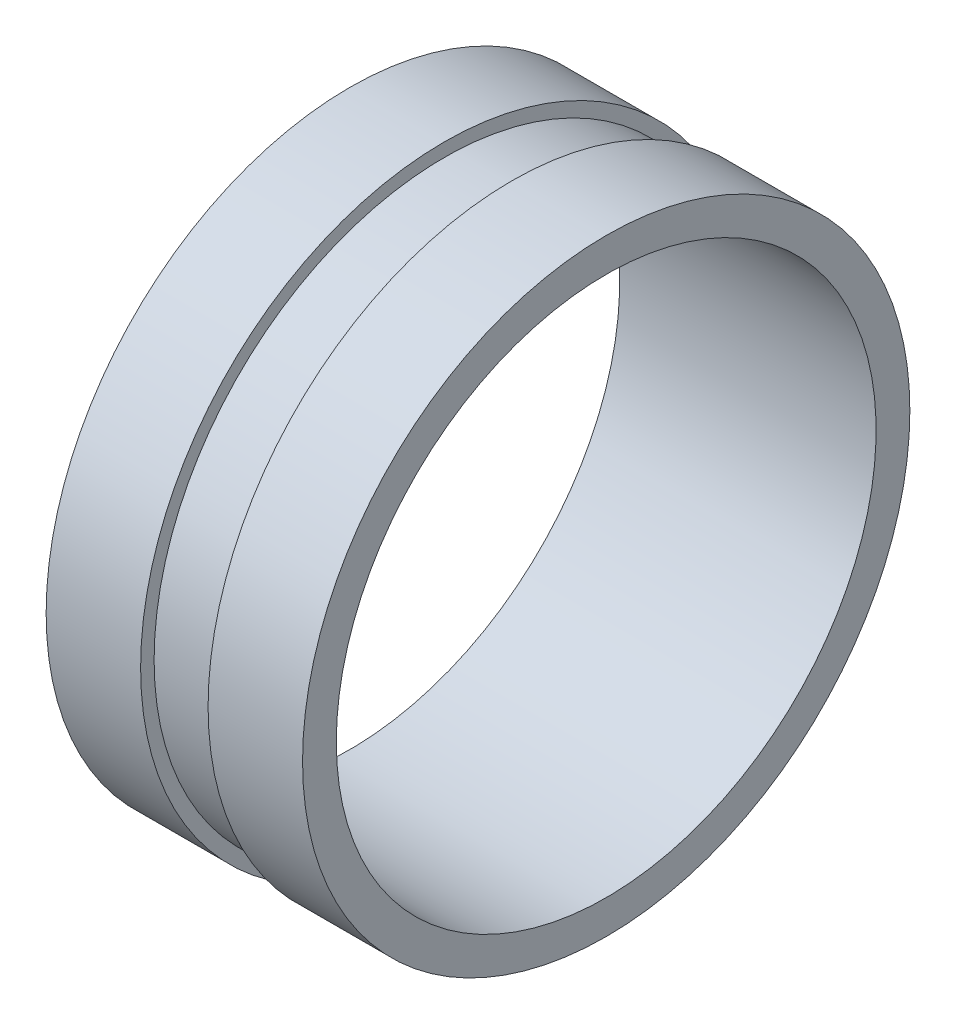
ISO-10303-21;
HEADER;
FILE_DESCRIPTION(('STEP AP214'),'2;1');
FILE_NAME('part.step','',(''),(''),'','','');
FILE_SCHEMA(('AUTOMOTIVE_DESIGN { 1 0 10303 214 1 1 1 1 }'));
ENDSEC;
DATA;
#1=APPLICATION_CONTEXT('core data for automotive mechanical design processes');
#2=APPLICATION_PROTOCOL_DEFINITION('international standard','automotive_design',2000,#1);
#3=PRODUCT_CONTEXT('',#1,'mechanical');
#4=PRODUCT('Part','Part','',(#3));
#5=PRODUCT_RELATED_PRODUCT_CATEGORY('part','',(#4));
#6=PRODUCT_DEFINITION_FORMATION('','',#4);
#7=PRODUCT_DEFINITION_CONTEXT('part definition',#1,'design');
#8=PRODUCT_DEFINITION('design','',#6,#7);
#9=PRODUCT_DEFINITION_SHAPE('','',#8);
#10=(LENGTH_UNIT() NAMED_UNIT(*) SI_UNIT(.MILLI.,.METRE.));
#11=(NAMED_UNIT(*) PLANE_ANGLE_UNIT() SI_UNIT($,.RADIAN.));
#12=(NAMED_UNIT(*) SI_UNIT($,.STERADIAN.) SOLID_ANGLE_UNIT());
#13=UNCERTAINTY_MEASURE_WITH_UNIT(LENGTH_MEASURE(1.E-05),#10,'distance_accuracy_value','');
#14=(GEOMETRIC_REPRESENTATION_CONTEXT(3) GLOBAL_UNCERTAINTY_ASSIGNED_CONTEXT((#13)) GLOBAL_UNIT_ASSIGNED_CONTEXT((#10,
#11,#12)) REPRESENTATION_CONTEXT('',''));
#15=CARTESIAN_POINT('',(0.,0.,0.));
#16=DIRECTION('',(0.,0.,1.));
#17=DIRECTION('',(1.,0.,0.));
#18=AXIS2_PLACEMENT_3D('',#15,#16,#17);
#19=CARTESIAN_POINT('',(24.13,0.,0.));
#20=DIRECTION('',(-1.,0.,0.));
#21=DIRECTION('',(0.,0.,1.));
#22=AXIS2_PLACEMENT_3D('',#19,#20,#21);
#23=CYLINDRICAL_SURFACE('',#22,28.575);
#24=CARTESIAN_POINT('',(0.,0.,0.));
#25=DIRECTION('',(1.,0.,0.));
#26=DIRECTION('',(0.,0.,-1.));
#27=AXIS2_PLACEMENT_3D('',#24,#25,#26);
#28=CIRCLE('',#27,28.575);
#29=CARTESIAN_POINT('',(0.,0.,28.575));
#30=VERTEX_POINT('',#29);
#31=EDGE_CURVE('E37',#30,#30,#28,.T.);
#32=CARTESIAN_POINT('',(8.89000000000001,0.,0.));
#33=DIRECTION('',(1.,0.,0.));
#34=DIRECTION('',(0.,0.,-1.));
#35=AXIS2_PLACEMENT_3D('',#32,#33,#34);
#36=CIRCLE('',#35,28.575);
#37=CARTESIAN_POINT('',(8.89000000000001,0.,28.575));
#38=VERTEX_POINT('',#37);
#39=EDGE_CURVE('E33',#38,#38,#36,.T.);
#40=CARTESIAN_POINT('',(0.,0.,28.575));
#41=CARTESIAN_POINT('',(0.0926041666666639,0.,28.575));
#42=CARTESIAN_POINT('',(0.185208333333331,0.,28.575));
#43=CARTESIAN_POINT('',(0.370416666666665,0.,28.575));
#44=CARTESIAN_POINT('',(0.463020833333331,0.,28.575));
#45=CARTESIAN_POINT('',(0.648229166666664,0.,28.575));
#46=CARTESIAN_POINT('',(0.740833333333332,0.,28.575));
#47=CARTESIAN_POINT('',(0.926041666666665,0.,28.575));
#48=CARTESIAN_POINT('',(1.01864583333333,0.,28.575));
#49=CARTESIAN_POINT('',(1.20385416666666,0.,28.575));
#50=CARTESIAN_POINT('',(1.29645833333333,0.,28.575));
#51=CARTESIAN_POINT('',(1.48166666666667,0.,28.575));
#52=CARTESIAN_POINT('',(1.57427083333333,0.,28.575));
#53=CARTESIAN_POINT('',(1.75947916666667,0.,28.575));
#54=CARTESIAN_POINT('',(1.85208333333333,0.,28.575));
#55=CARTESIAN_POINT('',(2.03729166666667,0.,28.575));
#56=CARTESIAN_POINT('',(2.12989583333333,0.,28.575));
#57=CARTESIAN_POINT('',(2.31510416666667,0.,28.575));
#58=CARTESIAN_POINT('',(2.40770833333333,0.,28.575));
#59=CARTESIAN_POINT('',(2.59291666666667,0.,28.575));
#60=CARTESIAN_POINT('',(2.68552083333333,0.,28.575));
#61=CARTESIAN_POINT('',(2.87072916666667,0.,28.575));
#62=CARTESIAN_POINT('',(2.96333333333333,0.,28.575));
#63=CARTESIAN_POINT('',(3.14854166666667,0.,28.575));
#64=CARTESIAN_POINT('',(3.24114583333333,0.,28.575));
#65=CARTESIAN_POINT('',(3.42635416666667,0.,28.575));
#66=CARTESIAN_POINT('',(3.51895833333333,0.,28.575));
#67=CARTESIAN_POINT('',(3.70416666666667,0.,28.575));
#68=CARTESIAN_POINT('',(3.79677083333334,0.,28.575));
#69=CARTESIAN_POINT('',(3.98197916666667,0.,28.575));
#70=CARTESIAN_POINT('',(4.07458333333334,0.,28.575));
#71=CARTESIAN_POINT('',(4.25979166666667,0.,28.575));
#72=CARTESIAN_POINT('',(4.35239583333334,0.,28.575));
#73=CARTESIAN_POINT('',(4.53760416666667,0.,28.575));
#74=CARTESIAN_POINT('',(4.63020833333334,0.,28.575));
#75=CARTESIAN_POINT('',(4.81541666666667,0.,28.575));
#76=CARTESIAN_POINT('',(4.90802083333334,0.,28.575));
#77=CARTESIAN_POINT('',(5.09322916666667,0.,28.575));
#78=CARTESIAN_POINT('',(5.18583333333334,0.,28.575));
#79=CARTESIAN_POINT('',(5.37104166666667,0.,28.575));
#80=CARTESIAN_POINT('',(5.46364583333334,0.,28.575));
#81=CARTESIAN_POINT('',(5.64885416666667,0.,28.575));
#82=CARTESIAN_POINT('',(5.74145833333334,0.,28.575));
#83=CARTESIAN_POINT('',(5.92666666666667,0.,28.575));
#84=CARTESIAN_POINT('',(6.01927083333334,0.,28.575));
#85=CARTESIAN_POINT('',(6.20447916666667,0.,28.575));
#86=CARTESIAN_POINT('',(6.29708333333334,0.,28.575));
#87=CARTESIAN_POINT('',(6.48229166666667,0.,28.575));
#88=CARTESIAN_POINT('',(6.57489583333334,0.,28.575));
#89=CARTESIAN_POINT('',(6.76010416666667,0.,28.575));
#90=CARTESIAN_POINT('',(6.85270833333334,0.,28.575));
#91=CARTESIAN_POINT('',(7.03791666666667,0.,28.575));
#92=CARTESIAN_POINT('',(7.13052083333334,0.,28.575));
#93=CARTESIAN_POINT('',(7.31572916666667,0.,28.575));
#94=CARTESIAN_POINT('',(7.40833333333334,0.,28.575));
#95=CARTESIAN_POINT('',(7.59354166666667,0.,28.575));
#96=CARTESIAN_POINT('',(7.68614583333334,0.,28.575));
#97=CARTESIAN_POINT('',(7.87135416666667,0.,28.575));
#98=CARTESIAN_POINT('',(7.96395833333334,0.,28.575));
#99=CARTESIAN_POINT('',(8.14916666666667,0.,28.575));
#100=CARTESIAN_POINT('',(8.24177083333334,0.,28.575));
#101=CARTESIAN_POINT('',(8.42697916666667,0.,28.575));
#102=CARTESIAN_POINT('',(8.51958333333334,0.,28.575));
#103=CARTESIAN_POINT('',(8.70479166666667,0.,28.575));
#104=CARTESIAN_POINT('',(8.79739583333334,0.,28.575));
#105=CARTESIAN_POINT('',(8.89000000000001,0.,28.575));
#106=B_SPLINE_CURVE_WITH_KNOTS('',3,(#40,#41,#42,#43,#44,#45,#46,#47,#48,#49,#50,#51,#52,#53,
#54,#55,#56,#57,#58,#59,#60,#61,#62,#63,#64,#65,#66,#67,#68,#69,#70,#71,#72,#73,#74,#75,#76,#77,
#78,#79,#80,#81,#82,#83,#84,#85,#86,#87,#88,#89,#90,#91,#92,#93,#94,#95,#96,#97,#98,#99,#100,
#101,#102,#103,#104,#105),.UNSPECIFIED.,.F.,.F.,(4,2,2,2,2,2,2,2,2,2,2,2,2,2,2,2,2,2,2,2,2,2,2,
2,2,2,2,2,2,2,2,2,4),(0.,0.277812500000002,0.555625000000001,0.833437500000003,1.11125,
1.3890625,1.666875,1.9446875,2.2225,2.5003125,2.778125,3.0559375,3.33375,3.61156250000001,
3.88937500000001,4.16718750000001,4.445,4.72281250000001,5.00062500000001,5.27843750000001,
5.55625000000001,5.83406250000001,6.11187500000001,6.38968750000001,6.66750000000001,
6.94531250000001,7.22312500000001,7.50093750000001,7.77875000000001,8.05656250000001,
8.33437500000001,8.61218750000001,8.89000000000001),.UNSPECIFIED.);
#107=EDGE_CURVE('BSEAM30',#30,#38,#106,.T.);
#108=ORIENTED_EDGE('',*,*,#31,.T.);
#109=ORIENTED_EDGE('',*,*,#39,.F.);
#110=ORIENTED_EDGE('',*,*,#107,.T.);
#111=ORIENTED_EDGE('',*,*,#107,.F.);
#112=EDGE_LOOP('',(#108,#110,#109,#111));
#113=FACE_BOUND('',#112,.T.);
#114=ADVANCED_FACE('F30',(#113),#23,.T.);
#115=CARTESIAN_POINT('',(24.13,0.,0.));
#116=DIRECTION('',(1.,0.,0.));
#117=DIRECTION('',(0.,0.,-1.));
#118=AXIS2_PLACEMENT_3D('',#115,#116,#117);
#119=CIRCLE('',#118,28.575);
#120=CARTESIAN_POINT('',(24.13,0.,28.575));
#121=VERTEX_POINT('',#120);
#122=EDGE_CURVE('E10',#121,#121,#119,.T.);
#123=CARTESIAN_POINT('',(15.24,0.,0.));
#124=DIRECTION('',(-1.,0.,0.));
#125=DIRECTION('',(0.,0.,1.));
#126=AXIS2_PLACEMENT_3D('',#123,#124,#125);
#127=CIRCLE('',#126,28.575);
#128=CARTESIAN_POINT('',(15.24,0.,28.575));
#129=VERTEX_POINT('',#128);
#130=EDGE_CURVE('E47',#129,#129,#127,.T.);
#131=CARTESIAN_POINT('',(24.13,0.,28.575));
#132=CARTESIAN_POINT('',(24.0373958333333,0.,28.575));
#133=CARTESIAN_POINT('',(23.9447916666667,0.,28.575));
#134=CARTESIAN_POINT('',(23.7595833333333,0.,28.575));
#135=CARTESIAN_POINT('',(23.6669791666667,0.,28.575));
#136=CARTESIAN_POINT('',(23.4817708333333,0.,28.575));
#137=CARTESIAN_POINT('',(23.3891666666667,0.,28.575));
#138=CARTESIAN_POINT('',(23.2039583333333,0.,28.575));
#139=CARTESIAN_POINT('',(23.1113541666667,0.,28.575));
#140=CARTESIAN_POINT('',(22.9261458333333,0.,28.575));
#141=CARTESIAN_POINT('',(22.8335416666667,0.,28.575));
#142=CARTESIAN_POINT('',(22.6483333333333,0.,28.575));
#143=CARTESIAN_POINT('',(22.5557291666667,0.,28.575));
#144=CARTESIAN_POINT('',(22.3705208333333,0.,28.575));
#145=CARTESIAN_POINT('',(22.2779166666667,0.,28.575));
#146=CARTESIAN_POINT('',(22.0927083333333,0.,28.575));
#147=CARTESIAN_POINT('',(22.0001041666667,0.,28.575));
#148=CARTESIAN_POINT('',(21.8148958333333,0.,28.575));
#149=CARTESIAN_POINT('',(21.7222916666667,0.,28.575));
#150=CARTESIAN_POINT('',(21.5370833333333,0.,28.575));
#151=CARTESIAN_POINT('',(21.4444791666667,0.,28.575));
#152=CARTESIAN_POINT('',(21.2592708333333,0.,28.575));
#153=CARTESIAN_POINT('',(21.1666666666667,0.,28.575));
#154=CARTESIAN_POINT('',(20.9814583333333,0.,28.575));
#155=CARTESIAN_POINT('',(20.8888541666667,0.,28.575));
#156=CARTESIAN_POINT('',(20.7036458333333,0.,28.575));
#157=CARTESIAN_POINT('',(20.6110416666667,0.,28.575));
#158=CARTESIAN_POINT('',(20.4258333333333,0.,28.575));
#159=CARTESIAN_POINT('',(20.3332291666667,0.,28.575));
#160=CARTESIAN_POINT('',(20.1480208333333,0.,28.575));
#161=CARTESIAN_POINT('',(20.0554166666667,0.,28.575));
#162=CARTESIAN_POINT('',(19.8702083333333,0.,28.575));
#163=CARTESIAN_POINT('',(19.7776041666667,0.,28.575));
#164=CARTESIAN_POINT('',(19.5923958333333,0.,28.575));
#165=CARTESIAN_POINT('',(19.4997916666667,0.,28.575));
#166=CARTESIAN_POINT('',(19.3145833333333,0.,28.575));
#167=CARTESIAN_POINT('',(19.2219791666667,0.,28.575));
#168=CARTESIAN_POINT('',(19.0367708333333,0.,28.575));
#169=CARTESIAN_POINT('',(18.9441666666667,0.,28.575));
#170=CARTESIAN_POINT('',(18.7589583333333,0.,28.575));
#171=CARTESIAN_POINT('',(18.6663541666667,0.,28.575));
#172=CARTESIAN_POINT('',(18.4811458333333,0.,28.575));
#173=CARTESIAN_POINT('',(18.3885416666667,0.,28.575));
#174=CARTESIAN_POINT('',(18.2033333333333,0.,28.575));
#175=CARTESIAN_POINT('',(18.1107291666667,0.,28.575));
#176=CARTESIAN_POINT('',(17.9255208333333,0.,28.575));
#177=CARTESIAN_POINT('',(17.8329166666667,0.,28.575));
#178=CARTESIAN_POINT('',(17.6477083333333,0.,28.575));
#179=CARTESIAN_POINT('',(17.5551041666667,0.,28.575));
#180=CARTESIAN_POINT('',(17.3698958333333,0.,28.575));
#181=CARTESIAN_POINT('',(17.2772916666667,0.,28.575));
#182=CARTESIAN_POINT('',(17.0920833333333,0.,28.575));
#183=CARTESIAN_POINT('',(16.9994791666667,0.,28.575));
#184=CARTESIAN_POINT('',(16.8142708333333,0.,28.575));
#185=CARTESIAN_POINT('',(16.7216666666667,0.,28.575));
#186=CARTESIAN_POINT('',(16.5364583333333,0.,28.575));
#187=CARTESIAN_POINT('',(16.4438541666667,0.,28.575));
#188=CARTESIAN_POINT('',(16.2586458333333,0.,28.575));
#189=CARTESIAN_POINT('',(16.1660416666667,0.,28.575));
#190=CARTESIAN_POINT('',(15.9808333333333,0.,28.575));
#191=CARTESIAN_POINT('',(15.8882291666667,0.,28.575));
#192=CARTESIAN_POINT('',(15.7030208333333,0.,28.575));
#193=CARTESIAN_POINT('',(15.6104166666667,0.,28.575));
#194=CARTESIAN_POINT('',(15.4252083333333,0.,28.575));
#195=CARTESIAN_POINT('',(15.3326041666667,0.,28.575));
#196=CARTESIAN_POINT('',(15.24,0.,28.575));
#197=B_SPLINE_CURVE_WITH_KNOTS('',3,(#131,#132,#133,#134,#135,#136,#137,#138,#139,#140,#141,
#142,#143,#144,#145,#146,#147,#148,#149,#150,#151,#152,#153,#154,#155,#156,#157,#158,#159,#160,
#161,#162,#163,#164,#165,#166,#167,#168,#169,#170,#171,#172,#173,#174,#175,#176,#177,#178,#179,
#180,#181,#182,#183,#184,#185,#186,#187,#188,#189,#190,#191,#192,#193,#194,#195,#196),
.UNSPECIFIED.,.F.,.F.,(4,2,2,2,2,2,2,2,2,2,2,2,2,2,2,2,2,2,2,2,2,2,2,2,2,2,2,2,2,2,2,2,4),(0.,
0.277812499999999,0.555624999999997,0.833437499999996,1.11125,1.3890625,1.66687499999999,
1.9446875,2.2225,2.50031249999999,2.778125,3.05593749999999,3.33374999999999,3.61156249999999,
3.88937499999999,4.16718749999999,4.44499999999999,4.72281249999999,5.00062499999999,
5.27843749999999,5.55624999999999,5.83406249999999,6.11187499999999,6.38968749999999,
6.66749999999999,6.94531249999999,7.22312499999999,7.50093749999999,7.77874999999999,
8.05656249999999,8.33437499999999,8.61218749999999,8.88999999999999),.UNSPECIFIED.);
#198=EDGE_CURVE('BSEAM83',#121,#129,#197,.T.);
#199=ORIENTED_EDGE('',*,*,#122,.F.);
#200=ORIENTED_EDGE('',*,*,#130,.F.);
#201=ORIENTED_EDGE('',*,*,#198,.T.);
#202=ORIENTED_EDGE('',*,*,#198,.F.);
#203=EDGE_LOOP('',(#199,#201,#200,#202));
#204=FACE_BOUND('',#203,.T.);
#205=ADVANCED_FACE('F83',(#204),#23,.T.);
#206=CARTESIAN_POINT('',(24.13,0.,0.));
#207=DIRECTION('',(1.,0.,0.));
#208=DIRECTION('',(0.,0.,-1.));
#209=AXIS2_PLACEMENT_3D('',#206,#207,#208);
#210=PLANE('',#209);
#211=ORIENTED_EDGE('',*,*,#122,.T.);
#212=EDGE_LOOP('',(#211));
#213=FACE_BOUND('',#212,.T.);
#214=CARTESIAN_POINT('',(24.13,0.,0.));
#215=DIRECTION('',(1.,0.,0.));
#216=DIRECTION('',(0.,0.,-1.));
#217=AXIS2_PLACEMENT_3D('',#214,#215,#216);
#218=CIRCLE('',#217,25.4);
#219=CARTESIAN_POINT('',(24.13,0.,25.4));
#220=VERTEX_POINT('',#219);
#221=EDGE_CURVE('E42',#220,#220,#218,.T.);
#222=ORIENTED_EDGE('',*,*,#221,.F.);
#223=EDGE_LOOP('',(#222));
#224=FACE_BOUND('',#223,.T.);
#225=ADVANCED_FACE('F79',(#213,#224),#210,.T.);
#226=CARTESIAN_POINT('',(0.,0.,0.));
#227=DIRECTION('',(1.,0.,0.));
#228=DIRECTION('',(0.,0.,-1.));
#229=AXIS2_PLACEMENT_3D('',#226,#227,#228);
#230=PLANE('',#229);
#231=ORIENTED_EDGE('',*,*,#31,.F.);
#232=EDGE_LOOP('',(#231));
#233=FACE_BOUND('',#232,.T.);
#234=CARTESIAN_POINT('',(0.,0.,0.));
#235=DIRECTION('',(1.,0.,0.));
#236=DIRECTION('',(0.,0.,-1.));
#237=AXIS2_PLACEMENT_3D('',#234,#235,#236);
#238=CIRCLE('',#237,25.4);
#239=CARTESIAN_POINT('',(0.,0.,25.4));
#240=VERTEX_POINT('',#239);
#241=EDGE_CURVE('E45',#240,#240,#238,.T.);
#242=ORIENTED_EDGE('',*,*,#241,.T.);
#243=EDGE_LOOP('',(#242));
#244=FACE_BOUND('',#243,.T.);
#245=ADVANCED_FACE('F66',(#233,#244),#230,.F.);
#246=CARTESIAN_POINT('',(24.13,0.,0.));
#247=DIRECTION('',(-1.,0.,0.));
#248=DIRECTION('',(0.,0.,1.));
#249=AXIS2_PLACEMENT_3D('',#246,#247,#248);
#250=CYLINDRICAL_SURFACE('',#249,25.4);
#251=CARTESIAN_POINT('',(24.13,0.,25.4));
#252=CARTESIAN_POINT('',(23.8786458333333,0.,25.4));
#253=CARTESIAN_POINT('',(23.6272916666667,0.,25.4));
#254=CARTESIAN_POINT('',(23.1245833333333,0.,25.4));
#255=CARTESIAN_POINT('',(22.8732291666667,0.,25.4));
#256=CARTESIAN_POINT('',(22.3705208333333,0.,25.4));
#257=CARTESIAN_POINT('',(22.1191666666667,0.,25.4));
#258=CARTESIAN_POINT('',(21.6164583333333,0.,25.4));
#259=CARTESIAN_POINT('',(21.3651041666667,0.,25.4));
#260=CARTESIAN_POINT('',(20.8623958333333,0.,25.4));
#261=CARTESIAN_POINT('',(20.6110416666667,0.,25.4));
#262=CARTESIAN_POINT('',(20.1083333333333,0.,25.4));
#263=CARTESIAN_POINT('',(19.8569791666667,0.,25.4));
#264=CARTESIAN_POINT('',(19.3542708333333,0.,25.4));
#265=CARTESIAN_POINT('',(19.1029166666667,0.,25.4));
#266=CARTESIAN_POINT('',(18.6002083333333,0.,25.4));
#267=CARTESIAN_POINT('',(18.3488541666667,0.,25.4));
#268=CARTESIAN_POINT('',(17.8461458333333,0.,25.4));
#269=CARTESIAN_POINT('',(17.5947916666667,0.,25.4));
#270=CARTESIAN_POINT('',(17.0920833333333,0.,25.4));
#271=CARTESIAN_POINT('',(16.8407291666667,0.,25.4));
#272=CARTESIAN_POINT('',(16.3380208333333,0.,25.4));
#273=CARTESIAN_POINT('',(16.0866666666667,0.,25.4));
#274=CARTESIAN_POINT('',(15.5839583333333,0.,25.4));
#275=CARTESIAN_POINT('',(15.3326041666667,0.,25.4));
#276=CARTESIAN_POINT('',(14.8298958333333,0.,25.4));
#277=CARTESIAN_POINT('',(14.5785416666667,0.,25.4));
#278=CARTESIAN_POINT('',(14.0758333333333,0.,25.4));
#279=CARTESIAN_POINT('',(13.8244791666667,0.,25.4));
#280=CARTESIAN_POINT('',(13.3217708333333,0.,25.4));
#281=CARTESIAN_POINT('',(13.0704166666667,0.,25.4));
#282=CARTESIAN_POINT('',(12.5677083333333,0.,25.4));
#283=CARTESIAN_POINT('',(12.3163541666667,0.,25.4));
#284=CARTESIAN_POINT('',(11.8136458333333,0.,25.4));
#285=CARTESIAN_POINT('',(11.5622916666667,0.,25.4));
#286=CARTESIAN_POINT('',(11.0595833333333,0.,25.4));
#287=CARTESIAN_POINT('',(10.8082291666667,0.,25.4));
#288=CARTESIAN_POINT('',(10.3055208333333,0.,25.4));
#289=CARTESIAN_POINT('',(10.0541666666667,0.,25.4));
#290=CARTESIAN_POINT('',(9.55145833333333,0.,25.4));
#291=CARTESIAN_POINT('',(9.30010416666667,0.,25.4));
#292=CARTESIAN_POINT('',(8.79739583333333,0.,25.4));
#293=CARTESIAN_POINT('',(8.54604166666667,0.,25.4));
#294=CARTESIAN_POINT('',(8.04333333333333,0.,25.4));
#295=CARTESIAN_POINT('',(7.79197916666666,0.,25.4));
#296=CARTESIAN_POINT('',(7.28927083333333,0.,25.4));
#297=CARTESIAN_POINT('',(7.03791666666666,0.,25.4));
#298=CARTESIAN_POINT('',(6.53520833333333,0.,25.4));
#299=CARTESIAN_POINT('',(6.28385416666666,0.,25.4));
#300=CARTESIAN_POINT('',(5.78114583333333,0.,25.4));
#301=CARTESIAN_POINT('',(5.52979166666666,0.,25.4));
#302=CARTESIAN_POINT('',(5.02708333333333,0.,25.4));
#303=CARTESIAN_POINT('',(4.77572916666666,0.,25.4));
#304=CARTESIAN_POINT('',(4.27302083333333,0.,25.4));
#305=CARTESIAN_POINT('',(4.02166666666666,0.,25.4));
#306=CARTESIAN_POINT('',(3.51895833333333,0.,25.4));
#307=CARTESIAN_POINT('',(3.26760416666666,0.,25.4));
#308=CARTESIAN_POINT('',(2.76489583333333,0.,25.4));
#309=CARTESIAN_POINT('',(2.51354166666666,0.,25.4));
#310=CARTESIAN_POINT('',(2.01083333333333,0.,25.4));
#311=CARTESIAN_POINT('',(1.75947916666666,0.,25.4));
#312=CARTESIAN_POINT('',(1.25677083333333,0.,25.4));
#313=CARTESIAN_POINT('',(1.00541666666666,0.,25.4));
#314=CARTESIAN_POINT('',(0.50270833333333,0.,25.4));
#315=CARTESIAN_POINT('',(0.251354166666663,0.,25.4));
#316=CARTESIAN_POINT('',(0.,0.,25.4));
#317=B_SPLINE_CURVE_WITH_KNOTS('',3,(#251,#252,#253,#254,#255,#256,#257,#258,#259,#260,#261,
#262,#263,#264,#265,#266,#267,#268,#269,#270,#271,#272,#273,#274,#275,#276,#277,#278,#279,#280,
#281,#282,#283,#284,#285,#286,#287,#288,#289,#290,#291,#292,#293,#294,#295,#296,#297,#298,#299,
#300,#301,#302,#303,#304,#305,#306,#307,#308,#309,#310,#311,#312,#313,#314,#315,#316),
.UNSPECIFIED.,.F.,.F.,(4,2,2,2,2,2,2,2,2,2,2,2,2,2,2,2,2,2,2,2,2,2,2,2,2,2,2,2,2,2,2,2,4),(0.,
0.7540625,1.508125,2.2621875,3.01625,3.7703125,4.524375,5.2784375,6.0325,6.7865625,7.540625,
8.2946875,9.04875,9.8028125,10.556875,11.3109375,12.065,12.8190625,13.573125,14.3271875,
15.08125,15.8353125,16.589375,17.3434375,18.0975,18.8515625,19.605625,20.3596875,21.11375,
21.8678125,22.621875,23.3759375,24.13),.UNSPECIFIED.);
#318=EDGE_CURVE('BSEAM68',#220,#240,#317,.T.);
#319=ORIENTED_EDGE('',*,*,#221,.T.);
#320=ORIENTED_EDGE('',*,*,#241,.F.);
#321=ORIENTED_EDGE('',*,*,#318,.T.);
#322=ORIENTED_EDGE('',*,*,#318,.F.);
#323=EDGE_LOOP('',(#319,#321,#320,#322));
#324=FACE_BOUND('',#323,.T.);
#325=ADVANCED_FACE('F68',(#324),#250,.F.);
#326=CARTESIAN_POINT('',(8.89000000000001,27.305,0.));
#327=DIRECTION('',(1.,0.,0.));
#328=DIRECTION('',(0.,0.,-1.));
#329=AXIS2_PLACEMENT_3D('',#326,#327,#328);
#330=PLANE('',#329);
#331=CARTESIAN_POINT('',(8.89000000000001,0.,0.));
#332=DIRECTION('',(-1.,0.,0.));
#333=DIRECTION('',(0.,0.,1.));
#334=AXIS2_PLACEMENT_3D('',#331,#332,#333);
#335=CIRCLE('',#334,27.305);
#336=CARTESIAN_POINT('',(8.89000000000001,0.,27.305));
#337=VERTEX_POINT('',#336);
#338=EDGE_CURVE('E49',#337,#337,#335,.T.);
#339=ORIENTED_EDGE('',*,*,#338,.T.);
#340=EDGE_LOOP('',(#339));
#341=FACE_BOUND('',#340,.T.);
#342=ORIENTED_EDGE('',*,*,#39,.T.);
#343=EDGE_LOOP('',(#342));
#344=FACE_BOUND('',#343,.T.);
#345=ADVANCED_FACE('F70',(#341,#344),#330,.T.);
#346=CARTESIAN_POINT('',(15.24,28.575,0.));
#347=DIRECTION('',(-1.,0.,0.));
#348=DIRECTION('',(0.,0.,1.));
#349=AXIS2_PLACEMENT_3D('',#346,#347,#348);
#350=PLANE('',#349);
#351=CARTESIAN_POINT('',(15.24,0.,0.));
#352=DIRECTION('',(-1.,0.,0.));
#353=DIRECTION('',(0.,0.,1.));
#354=AXIS2_PLACEMENT_3D('',#351,#352,#353);
#355=CIRCLE('',#354,27.305);
#356=CARTESIAN_POINT('',(15.24,0.,27.305));
#357=VERTEX_POINT('',#356);
#358=EDGE_CURVE('E54',#357,#357,#355,.T.);
#359=ORIENTED_EDGE('',*,*,#358,.F.);
#360=EDGE_LOOP('',(#359));
#361=FACE_BOUND('',#360,.T.);
#362=ORIENTED_EDGE('',*,*,#130,.T.);
#363=EDGE_LOOP('',(#362));
#364=FACE_BOUND('',#363,.T.);
#365=ADVANCED_FACE('F77',(#361,#364),#350,.T.);
#366=CARTESIAN_POINT('',(24.13,0.,0.));
#367=DIRECTION('',(-1.,0.,0.));
#368=DIRECTION('',(0.,0.,1.));
#369=AXIS2_PLACEMENT_3D('',#366,#367,#368);
#370=CYLINDRICAL_SURFACE('',#369,27.305);
#371=ORIENTED_EDGE('',*,*,#358,.T.);
#372=EDGE_LOOP('',(#371));
#373=FACE_BOUND('',#372,.T.);
#374=ORIENTED_EDGE('',*,*,#338,.F.);
#375=EDGE_LOOP('',(#374));
#376=FACE_BOUND('',#375,.T.);
#377=ADVANCED_FACE('F133',(#373,#376),#370,.T.);
#378=CLOSED_SHELL('',(#114,#205,#225,#245,#325,#345,#365,#377));
#379=MANIFOLD_SOLID_BREP('B2',#378);
#380=ADVANCED_BREP_SHAPE_REPRESENTATION('',(#18,#379),#14);
#381=SHAPE_DEFINITION_REPRESENTATION(#9,#380);
ENDSEC;
END-ISO-10303-21;
